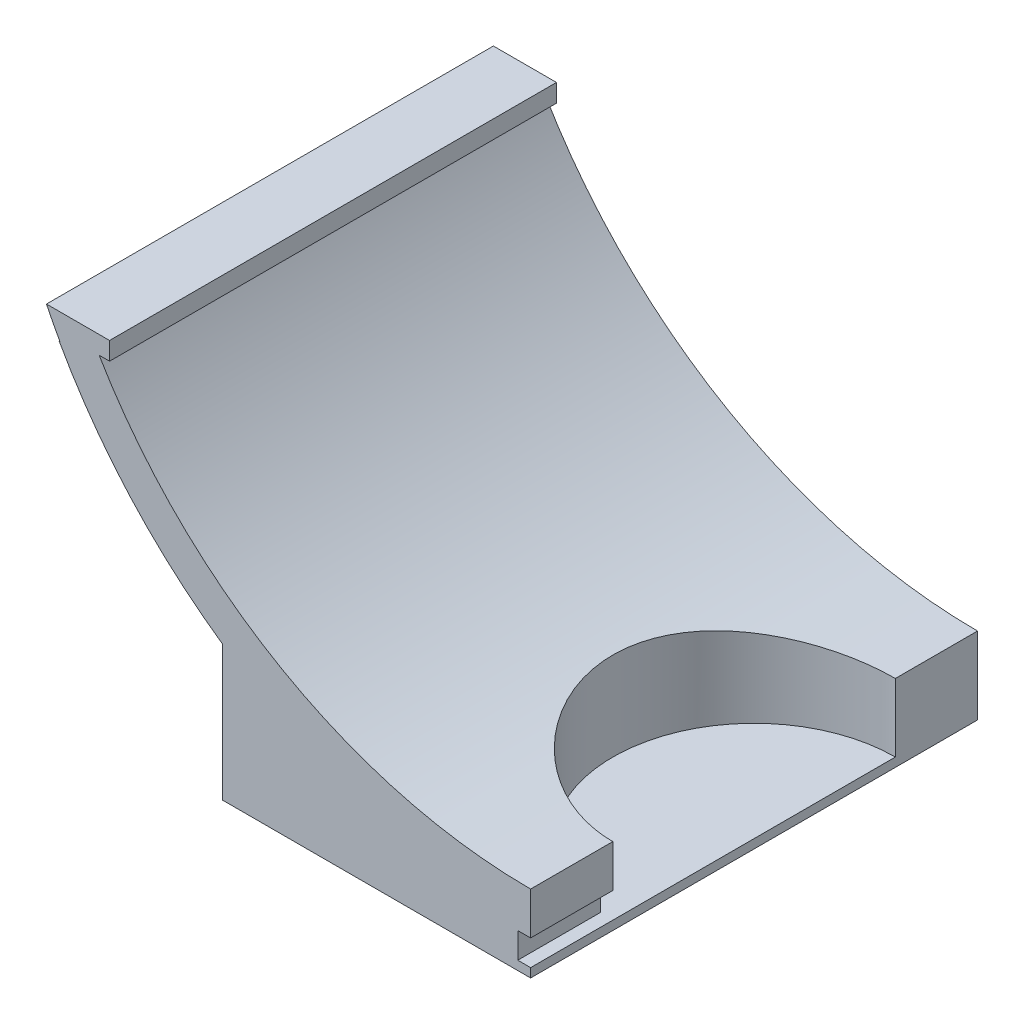
ISO-10303-21;
HEADER;
FILE_DESCRIPTION(('STEP AP214'),'2;1');
FILE_NAME('part.step','',(''),(''),'','','');
FILE_SCHEMA(('AUTOMOTIVE_DESIGN { 1 0 10303 214 1 1 1 1 }'));
ENDSEC;
DATA;
#1=APPLICATION_CONTEXT('core data for automotive mechanical design processes');
#2=APPLICATION_PROTOCOL_DEFINITION('international standard','automotive_design',2000,#1);
#3=PRODUCT_CONTEXT('',#1,'mechanical');
#4=PRODUCT('Part','Part','',(#3));
#5=PRODUCT_RELATED_PRODUCT_CATEGORY('part','',(#4));
#6=PRODUCT_DEFINITION_FORMATION('','',#4);
#7=PRODUCT_DEFINITION_CONTEXT('part definition',#1,'design');
#8=PRODUCT_DEFINITION('design','',#6,#7);
#9=PRODUCT_DEFINITION_SHAPE('','',#8);
#10=(LENGTH_UNIT() NAMED_UNIT(*) SI_UNIT(.MILLI.,.METRE.));
#11=(NAMED_UNIT(*) PLANE_ANGLE_UNIT() SI_UNIT($,.RADIAN.));
#12=(NAMED_UNIT(*) SI_UNIT($,.STERADIAN.) SOLID_ANGLE_UNIT());
#13=UNCERTAINTY_MEASURE_WITH_UNIT(LENGTH_MEASURE(1.E-05),#10,'distance_accuracy_value','');
#14=(GEOMETRIC_REPRESENTATION_CONTEXT(3) GLOBAL_UNCERTAINTY_ASSIGNED_CONTEXT((#13)) GLOBAL_UNIT_ASSIGNED_CONTEXT((#10,
#11,#12)) REPRESENTATION_CONTEXT('',''));
#15=CARTESIAN_POINT('',(0.,0.,0.));
#16=DIRECTION('',(0.,0.,1.));
#17=DIRECTION('',(1.,0.,0.));
#18=AXIS2_PLACEMENT_3D('',#15,#16,#17);
#19=CARTESIAN_POINT('',(0.,0.,174.));
#20=DIRECTION('',(0.,0.,1.));
#21=DIRECTION('',(1.,0.,0.));
#22=AXIS2_PLACEMENT_3D('',#19,#20,#21);
#23=PLANE('',#22);
#24=DIRECTION('',(0.,-1.,0.));
#25=VECTOR('',#24,1.);
#26=CARTESIAN_POINT('',(0.,0.,174.));
#27=LINE('',#26,#25);
#28=CARTESIAN_POINT('',(0.,-195.,174.));
#29=VERTEX_POINT('',#28);
#30=CARTESIAN_POINT('',(0.,-211.5,174.));
#31=VERTEX_POINT('',#30);
#32=EDGE_CURVE('E65',#29,#31,#27,.T.);
#33=ORIENTED_EDGE('',*,*,#32,.F.);
#34=CARTESIAN_POINT('',(0.,0.,174.));
#35=DIRECTION('',(0.,0.,-1.));
#36=DIRECTION('',(1.,0.,0.));
#37=AXIS2_PLACEMENT_3D('',#34,#35,#36);
#38=CIRCLE('',#37,195.);
#39=CARTESIAN_POINT('',(-168.,-99.,174.));
#40=VERTEX_POINT('',#39);
#41=EDGE_CURVE('E242',#29,#40,#38,.T.);
#42=ORIENTED_EDGE('',*,*,#41,.T.);
#43=DIRECTION('',(-1.,0.,0.));
#44=VECTOR('',#43,1.);
#45=CARTESIAN_POINT('',(-163.933126534708,-99.,174.));
#46=LINE('',#45,#44);
#47=CARTESIAN_POINT('',(-163.933126534708,-99.,174.));
#48=VERTEX_POINT('',#47);
#49=EDGE_CURVE('E288',#48,#40,#46,.T.);
#50=ORIENTED_EDGE('',*,*,#49,.F.);
#51=DIRECTION('',(0.,-1.,0.));
#52=VECTOR('',#51,1.);
#53=CARTESIAN_POINT('',(-163.933126534708,-92.,174.));
#54=LINE('',#53,#52);
#55=CARTESIAN_POINT('',(-163.933126534708,-92.,174.));
#56=VERTEX_POINT('',#55);
#57=EDGE_CURVE('E285',#56,#48,#54,.T.);
#58=ORIENTED_EDGE('',*,*,#57,.F.);
#59=DIRECTION('',(-1.,0.,0.));
#60=VECTOR('',#59,1.);
#61=CARTESIAN_POINT('',(-188.496850106308,-92.,174.));
#62=LINE('',#61,#60);
#63=CARTESIAN_POINT('',(-188.496850106308,-92.,174.));
#64=VERTEX_POINT('',#63);
#65=EDGE_CURVE('E273',#56,#64,#62,.T.);
#66=ORIENTED_EDGE('',*,*,#65,.T.);
#67=CARTESIAN_POINT('',(0.,0.,174.));
#68=DIRECTION('',(0.,0.,1.));
#69=DIRECTION('',(1.,0.,0.));
#70=AXIS2_PLACEMENT_3D('',#67,#68,#69);
#71=CIRCLE('',#70,209.75);
#72=CARTESIAN_POINT('',(-183.278647146906,-102.,174.));
#73=VERTEX_POINT('',#72);
#74=EDGE_CURVE('E269',#64,#73,#71,.T.);
#75=ORIENTED_EDGE('',*,*,#74,.T.);
#76=DIRECTION('',(1.,0.,0.));
#77=VECTOR('',#76,1.);
#78=CARTESIAN_POINT('',(0.,-102.,174.));
#79=LINE('',#78,#77);
#80=CARTESIAN_POINT('',(-183.56470248934,-102.,174.));
#81=VERTEX_POINT('',#80);
#82=EDGE_CURVE('E258',#81,#73,#79,.T.);
#83=ORIENTED_EDGE('',*,*,#82,.F.);
#84=CARTESIAN_POINT('',(0.,0.,174.));
#85=DIRECTION('',(0.,0.,1.));
#86=DIRECTION('',(1.,0.,0.));
#87=AXIS2_PLACEMENT_3D('',#84,#85,#86);
#88=CIRCLE('',#87,210.);
#89=CARTESIAN_POINT('',(-120.,-172.336879396141,174.));
#90=VERTEX_POINT('',#89);
#91=EDGE_CURVE('E165',#81,#90,#88,.T.);
#92=ORIENTED_EDGE('',*,*,#91,.T.);
#93=DIRECTION('',(0.,1.,0.));
#94=VECTOR('',#93,1.);
#95=CARTESIAN_POINT('',(-120.,0.,174.));
#96=LINE('',#95,#94);
#97=CARTESIAN_POINT('',(-120.,-225.,174.));
#98=VERTEX_POINT('',#97);
#99=EDGE_CURVE('E241',#98,#90,#96,.T.);
#100=ORIENTED_EDGE('',*,*,#99,.F.);
#101=DIRECTION('',(1.,0.,0.));
#102=VECTOR('',#101,1.);
#103=CARTESIAN_POINT('',(0.,-225.,174.));
#104=LINE('',#103,#102);
#105=CARTESIAN_POINT('',(0.,-225.,174.));
#106=VERTEX_POINT('',#105);
#107=EDGE_CURVE('E175',#98,#106,#104,.T.);
#108=ORIENTED_EDGE('',*,*,#107,.T.);
#109=CARTESIAN_POINT('',(0.,-221.5,174.));
#110=VERTEX_POINT('',#109);
#111=EDGE_CURVE('E322',#110,#106,#27,.T.);
#112=ORIENTED_EDGE('',*,*,#111,.F.);
#113=DIRECTION('',(-1.,0.,0.));
#114=VECTOR('',#113,1.);
#115=CARTESIAN_POINT('',(0.,-221.5,174.));
#116=LINE('',#115,#114);
#117=CARTESIAN_POINT('',(-5.,-221.5,174.));
#118=VERTEX_POINT('',#117);
#119=EDGE_CURVE('E316',#110,#118,#116,.T.);
#120=ORIENTED_EDGE('',*,*,#119,.T.);
#121=DIRECTION('',(0.,1.,0.));
#122=VECTOR('',#121,1.);
#123=CARTESIAN_POINT('',(-5.,0.,174.));
#124=LINE('',#123,#122);
#125=CARTESIAN_POINT('',(-5.,-211.5,174.));
#126=VERTEX_POINT('',#125);
#127=EDGE_CURVE('E309',#118,#126,#124,.T.);
#128=ORIENTED_EDGE('',*,*,#127,.T.);
#129=DIRECTION('',(1.,0.,0.));
#130=VECTOR('',#129,1.);
#131=CARTESIAN_POINT('',(0.,-211.5,174.));
#132=LINE('',#131,#130);
#133=EDGE_CURVE('E314',#126,#31,#132,.T.);
#134=ORIENTED_EDGE('',*,*,#133,.T.);
#135=EDGE_LOOP('',(#33,#42,#50,#58,#66,#75,#83,#92,#100,#108,#112,#120,#128,#134));
#136=FACE_BOUND('',#135,.T.);
#137=ADVANCED_FACE('F43',(#136),#23,.T.);
#138=CARTESIAN_POINT('',(0.,-221.5,87.));
#139=DIRECTION('',(0.,1.,0.));
#140=DIRECTION('',(0.,0.,1.));
#141=AXIS2_PLACEMENT_3D('',#138,#139,#140);
#142=CYLINDRICAL_SURFACE('',#141,55.);
#143=CARTESIAN_POINT('',(0.,-195.,142.));
#144=CARTESIAN_POINT('',(1.51277598464168,-194.999997304751,141.999995610297));
#145=CARTESIAN_POINT('',(3.02563306617673,-194.982353560653,141.93753465475));
#146=CARTESIAN_POINT('',(6.04030681610823,-194.912258782389,141.688232088754));
#147=CARTESIAN_POINT('',(7.54212268342941,-194.859805247374,141.501381541749));
#148=CARTESIAN_POINT('',(10.5242864998696,-194.721514711655,141.004861870919));
#149=CARTESIAN_POINT('',(12.0046267379808,-194.635666013523,140.69514971122));
#150=CARTESIAN_POINT('',(14.9327576670529,-194.432936319551,139.955576125098));
#151=CARTESIAN_POINT('',(16.3805488217454,-194.316055766129,139.525716411608));
#152=CARTESIAN_POINT('',(19.2316449690921,-194.054606947669,138.550081244053));
#153=CARTESIAN_POINT('',(20.6350093429244,-193.910077631711,138.004468735609));
#154=CARTESIAN_POINT('',(23.3900720949104,-193.597073533787,136.80124640194));
#155=CARTESIAN_POINT('',(24.7417703476622,-193.428598693706,136.143636304901));
#156=CARTESIAN_POINT('',(27.3849321959632,-193.072121722803,134.72125352611));
#157=CARTESIAN_POINT('',(28.6763923140339,-192.884118466645,133.956474667808));
#158=CARTESIAN_POINT('',(31.1910004963923,-192.493482436804,132.32513389038));
#159=CARTESIAN_POINT('',(32.4141473302252,-192.290849399763,131.458570138783));
#160=CARTESIAN_POINT('',(34.8121052649309,-191.871397239887,129.608255675445));
#161=CARTESIAN_POINT('',(35.985145512741,-191.654358471269,128.62225916456));
#162=CARTESIAN_POINT('',(38.2445264347831,-191.21631917666,126.556283582681));
#163=CARTESIAN_POINT('',(39.3308658605527,-190.995318593676,125.47630315882));
#164=CARTESIAN_POINT('',(41.4100573863605,-190.555337694959,123.229140506784));
#165=CARTESIAN_POINT('',(42.4028965244983,-190.336357663118,122.061946228299));
#166=CARTESIAN_POINT('',(44.2884084378103,-189.906482695444,119.647858408345));
#167=CARTESIAN_POINT('',(45.181080405655,-189.695587824785,118.400964224635));
#168=CARTESIAN_POINT('',(46.8765745407372,-189.283815921787,115.810239545886));
#169=CARTESIAN_POINT('',(47.6772977159791,-189.083215525293,114.464990030597));
#170=CARTESIAN_POINT('',(49.162230637943,-188.702577945346,111.708813244506));
#171=CARTESIAN_POINT('',(49.8464384655657,-188.522541100608,110.297884892409));
#172=CARTESIAN_POINT('',(51.0927350973465,-188.188599218257,107.42034060372));
#173=CARTESIAN_POINT('',(51.6548437850889,-188.034689926722,105.953733780017));
#174=CARTESIAN_POINT('',(52.6522576710364,-187.757844041035,102.97517381577));
#175=CARTESIAN_POINT('',(53.0875668143327,-187.634906483282,101.46322208765));
#176=CARTESIAN_POINT('',(53.8181863976163,-187.426635157743,98.4435623179981));
#177=CARTESIAN_POINT('',(54.1167289707947,-187.340437004747,96.936695711525));
#178=CARTESIAN_POINT('',(54.586856670881,-187.203993562236,93.9016672922743));
#179=CARTESIAN_POINT('',(54.75844373239,-187.153747724864,92.3735058043586));
#180=CARTESIAN_POINT('',(54.9730432374301,-187.090825739297,89.3076899008145));
#181=CARTESIAN_POINT('',(55.0160792915418,-187.078142692059,87.7700372803878));
#182=CARTESIAN_POINT('',(54.9732343190708,-187.09073748328,84.6967010099465));
#183=CARTESIAN_POINT('',(54.887355681379,-187.116014618306,83.1610173239737));
#184=CARTESIAN_POINT('',(54.5922403009783,-187.202323309921,80.1515882440086));
#185=CARTESIAN_POINT('',(54.3869816817835,-187.262201453032,78.6774175080696));
#186=CARTESIAN_POINT('',(53.8581194766046,-187.41499037387,75.7522458772274));
#187=CARTESIAN_POINT('',(53.5345187495676,-187.507900353601,74.3012444234769));
#188=CARTESIAN_POINT('',(52.7716565927596,-187.724024039912,71.4322191048295));
#189=CARTESIAN_POINT('',(52.3323881639886,-187.847239580238,70.0141972411653));
#190=CARTESIAN_POINT('',(51.3416985166608,-188.120423591712,67.2205508089576));
#191=CARTESIAN_POINT('',(50.7902750928457,-188.270392588895,65.8449270746838));
#192=CARTESIAN_POINT('',(49.5719407427942,-188.594869390542,63.1281257936024));
#193=CARTESIAN_POINT('',(48.9036859021021,-188.769657733188,61.7875846456117));
#194=CARTESIAN_POINT('',(47.4613520849324,-189.137446531583,59.1673453312611));
#195=CARTESIAN_POINT('',(46.6872726568405,-189.330447065053,57.8876474245857));
#196=CARTESIAN_POINT('',(45.0384344896766,-189.729435603099,55.3966655699284));
#197=CARTESIAN_POINT('',(44.1636575337009,-189.935425954569,54.1853940600432));
#198=CARTESIAN_POINT('',(42.3192039321344,-190.354877199058,51.838767050779));
#199=CARTESIAN_POINT('',(41.3495249884407,-190.568338272905,50.7034133909127));
#200=CARTESIAN_POINT('',(39.2840355631165,-191.005023396751,48.475253402716));
#201=CARTESIAN_POINT('',(38.1849013302693,-191.228318156092,47.3855395329822));
#202=CARTESIAN_POINT('',(35.8982517288536,-191.67073699137,45.3021832093801));
#203=CARTESIAN_POINT('',(34.7107341671541,-191.889860963646,44.3085431408805));
#204=CARTESIAN_POINT('',(32.2549075063342,-192.317899025981,42.4240354736116));
#205=CARTESIAN_POINT('',(30.9865936554316,-192.526812514263,41.5331739281184));
#206=CARTESIAN_POINT('',(28.3774891485624,-192.928639740406,39.8606401400473));
#207=CARTESIAN_POINT('',(27.0366989896612,-193.121553587973,39.0789671487516));
#208=CARTESIAN_POINT('',(24.2841503406643,-193.486995820346,37.626785886393));
#209=CARTESIAN_POINT('',(22.872049070732,-193.659409035535,36.9568978383738));
#210=CARTESIAN_POINT('',(19.9933641479954,-193.977736178376,35.7388260939951));
#211=CARTESIAN_POINT('',(18.5267800671251,-194.123649897772,35.1906433540984));
#212=CARTESIAN_POINT('',(15.5499999242052,-194.384745205353,34.2207670888056));
#213=CARTESIAN_POINT('',(14.0398126256082,-194.499932921909,33.7990483377956));
#214=CARTESIAN_POINT('',(10.9868456927494,-194.696246881347,33.0857502506882));
#215=CARTESIAN_POINT('',(9.44406710114175,-194.777374212154,32.7941667579131));
#216=CARTESIAN_POINT('',(6.38759737955367,-194.901161078377,32.3510633816287));
#217=CARTESIAN_POINT('',(4.87455911709058,-194.94497035096,32.1953533234206));
#218=CARTESIAN_POINT('',(1.84018665814559,-194.997220478891,32.0097825472414));
#219=CARTESIAN_POINT('',(0.318852639704865,-195.005662090324,31.9799191389463));
#220=CARTESIAN_POINT('',(-2.72067114375175,-194.986942029158,32.0463054967055));
#221=CARTESIAN_POINT('',(-4.23886122557451,-194.959784138108,32.1425418678469));
#222=CARTESIAN_POINT('',(-7.26103653739713,-194.870630723845,32.4602353545998));
#223=CARTESIAN_POINT('',(-8.765021849285,-194.808635401589,32.6816917478914));
#224=CARTESIAN_POINT('',(-11.7185674550566,-194.653074412565,33.2423005147627));
#225=CARTESIAN_POINT('',(-13.1686167043497,-194.560151370275,33.5790608624129));
#226=CARTESIAN_POINT('',(-16.0346101227006,-194.344941863136,34.3682562724752));
#227=CARTESIAN_POINT('',(-17.4505548668401,-194.222655893797,34.8206893828778));
#228=CARTESIAN_POINT('',(-20.239101414165,-193.951905110252,35.837693591339));
#229=CARTESIAN_POINT('',(-21.6116996780089,-193.803438164791,36.4022738191746));
#230=CARTESIAN_POINT('',(-24.3046889918928,-193.484162013078,37.6393085686977));
#231=CARTESIAN_POINT('',(-25.6250788776387,-193.313352308927,38.3117654944437));
#232=CARTESIAN_POINT('',(-28.2329132181185,-192.949922490515,39.7751609714886));
#233=CARTESIAN_POINT('',(-29.519061548626,-192.756916069748,40.5683133943173));
#234=CARTESIAN_POINT('',(-32.0203400821098,-192.35722551291,42.2565691287422));
#235=CARTESIAN_POINT('',(-33.235469482682,-192.150541222357,43.1516735919021));
#236=CARTESIAN_POINT('',(-35.5874725145358,-191.728870384718,45.0380551409026));
#237=CARTESIAN_POINT('',(-36.7243310563164,-191.513882249171,46.0293506827473));
#238=CARTESIAN_POINT('',(-38.9125867826961,-191.081278017958,48.1016524547747));
#239=CARTESIAN_POINT('',(-39.9639823382036,-190.863661872288,49.1826603942576));
#240=CARTESIAN_POINT('',(-42.0068287968446,-190.424663688709,51.4634820536823));
#241=CARTESIAN_POINT('',(-42.9953032651288,-190.203382512631,52.6659833901291));
#242=CARTESIAN_POINT('',(-44.8675674807035,-189.770453355497,55.151572228421));
#243=CARTESIAN_POINT('',(-45.7513547796848,-189.558805599808,56.4346616138977));
#244=CARTESIAN_POINT('',(-47.4079032742508,-189.151311295467,59.0730086424281));
#245=CARTESIAN_POINT('',(-48.1806657935975,-188.95546455843,60.4282654247568));
#246=CARTESIAN_POINT('',(-49.609306663953,-188.585422348909,63.2018895610344));
#247=CARTESIAN_POINT('',(-50.2651868880261,-188.41122652948,64.6202559031836));
#248=CARTESIAN_POINT('',(-51.4515194101969,-188.090714591469,67.5024025647285));
#249=CARTESIAN_POINT('',(-51.9826387878447,-187.944251048306,68.9658917148034));
#250=CARTESIAN_POINT('',(-52.9195244587185,-187.682606546131,71.935223920435));
#251=CARTESIAN_POINT('',(-53.32529079328,-187.567425576802,73.4410669620252));
#252=CARTESIAN_POINT('',(-54.0077324467009,-187.372065704206,76.4835904167211));
#253=CARTESIAN_POINT('',(-54.2844395155644,-187.291878192473,78.0202631482542));
#254=CARTESIAN_POINT('',(-54.706299470099,-187.169092825265,81.113035288433));
#255=CARTESIAN_POINT('',(-54.8514566322037,-187.126493747863,82.6691340639081));
#256=CARTESIAN_POINT('',(-55.0059350885892,-187.081140474726,85.7311540434134));
#257=CARTESIAN_POINT('',(-55.0200592029773,-187.07697748964,87.2368141228749));
#258=CARTESIAN_POINT('',(-54.9248583842064,-187.104950316674,90.2438606326164));
#259=CARTESIAN_POINT('',(-54.8155366395511,-187.137085191252,91.7452471722744));
#260=CARTESIAN_POINT('',(-54.474438998226,-187.236660182412,94.7327825235859));
#261=CARTESIAN_POINT('',(-54.242667739981,-187.304098961669,96.2189319102538));
#262=CARTESIAN_POINT('',(-53.6587131692459,-187.472223660234,99.1654548680127));
#263=CARTESIAN_POINT('',(-53.306529257297,-187.572909745057,100.625828310743));
#264=CARTESIAN_POINT('',(-52.4887374259627,-187.803383553097,103.496617769752));
#265=CARTESIAN_POINT('',(-52.0242661681516,-187.932878661644,104.907381560932));
#266=CARTESIAN_POINT('',(-50.9838485852516,-188.217793669274,107.684434863653));
#267=CARTESIAN_POINT('',(-50.4079034401043,-188.373213293946,109.050724845765));
#268=CARTESIAN_POINT('',(-49.1487429468255,-188.705656652546,111.730405540767));
#269=CARTESIAN_POINT('',(-48.4655133229456,-188.882683260896,113.043789184439));
#270=CARTESIAN_POINT('',(-46.9966216973714,-189.253510163334,115.609488643802));
#271=CARTESIAN_POINT('',(-46.2109569467775,-189.447310907518,116.861802819423));
#272=CARTESIAN_POINT('',(-44.5151536149936,-189.853062976584,119.337676095336));
#273=CARTESIAN_POINT('',(-43.6017904708369,-190.065400173821,120.558964323428));
#274=CARTESIAN_POINT('',(-41.6774853507142,-190.496612007318,122.920853720066));
#275=CARTESIAN_POINT('',(-40.66654134687,-190.715486779373,124.061453210924));
#276=CARTESIAN_POINT('',(-38.5533331692757,-191.153877639405,126.255068471827));
#277=CARTESIAN_POINT('',(-37.4510474753336,-191.373393866689,127.308063484396));
#278=CARTESIAN_POINT('',(-35.1622995871373,-191.807114286307,129.319424849606));
#279=CARTESIAN_POINT('',(-33.975836966903,-192.021318451751,130.277790723315));
#280=CARTESIAN_POINT('',(-31.4957016907239,-192.443866652879,132.116095107206));
#281=CARTESIAN_POINT('',(-30.2000984393956,-192.651933098431,132.993495252527));
#282=CARTESIAN_POINT('',(-27.5368111149729,-193.05060678832,134.63582320654));
#283=CARTESIAN_POINT('',(-26.169123975991,-193.241213289103,135.400746226079));
#284=CARTESIAN_POINT('',(-23.3717389221184,-193.599455338112,136.811793217101));
#285=CARTESIAN_POINT('',(-21.9420720610811,-193.76710221867,137.457975850282));
#286=CARTESIAN_POINT('',(-19.0302533374737,-194.074706450383,138.626638816058));
#287=CARTESIAN_POINT('',(-17.5481076720372,-194.21466705819,139.149133699094));
#288=CARTESIAN_POINT('',(-14.7498370514193,-194.445706299648,140.002612249688));
#289=CARTESIAN_POINT('',(-13.4390480304431,-194.540866112287,140.350078116561));
#290=CARTESIAN_POINT('',(-10.793930863323,-194.705537511506,140.947464884264));
#291=CARTESIAN_POINT('',(-9.45960527280495,-194.775051864951,141.197396308171));
#292=CARTESIAN_POINT('',(-6.77514063970241,-194.88689524458,141.597975951774));
#293=CARTESIAN_POINT('',(-5.42500326360649,-194.929227109878,141.748634540207));
#294=CARTESIAN_POINT('',(-2.71659953508749,-194.985781967651,141.949653066806));
#295=CARTESIAN_POINT('',(-1.35833245921605,-195.000002420084,142.000003941546));
#296=CARTESIAN_POINT('',(0.,-195.,142.));
#297=B_SPLINE_CURVE_WITH_KNOTS('',3,(#143,#144,#145,#146,#147,#148,#149,#150,#151,#152,#153,
#154,#155,#156,#157,#158,#159,#160,#161,#162,#163,#164,#165,#166,#167,#168,#169,#170,#171,#172,
#173,#174,#175,#176,#177,#178,#179,#180,#181,#182,#183,#184,#185,#186,#187,#188,#189,#190,#191,
#192,#193,#194,#195,#196,#197,#198,#199,#200,#201,#202,#203,#204,#205,#206,#207,#208,#209,#210,
#211,#212,#213,#214,#215,#216,#217,#218,#219,#220,#221,#222,#223,#224,#225,#226,#227,#228,#229,
#230,#231,#232,#233,#234,#235,#236,#237,#238,#239,#240,#241,#242,#243,#244,#245,#246,#247,#248,
#249,#250,#251,#252,#253,#254,#255,#256,#257,#258,#259,#260,#261,#262,#263,#264,#265,#266,#267,
#268,#269,#270,#271,#272,#273,#274,#275,#276,#277,#278,#279,#280,#281,#282,#283,#284,#285,#286,
#287,#288,#289,#290,#291,#292,#293,#294,#295,#296),.UNSPECIFIED.,.T.,.F.,(4,2,2,2,2,2,2,2,2,2,2,
2,2,2,2,2,2,2,2,2,2,2,2,2,2,2,2,2,2,2,2,2,2,2,2,2,2,2,2,2,2,2,2,2,2,2,2,2,2,2,2,2,2,2,2,2,2,2,2,
2,2,2,2,2,2,2,2,2,2,2,2,2,2,2,2,2,4),(0.,4.53708199552157,9.07448998504358,13.6134887398362,
18.1524227858136,22.6850092589732,27.2176067327461,31.7504655451402,36.2834059768057,
40.9211271113907,45.5589150155437,50.197344910504,54.835812187691,59.5650078593128,
64.2942814169713,69.0227842441797,73.7511399386241,78.3611174003492,82.9710246118645,
87.5800850833786,92.1890601464245,96.6525972976513,101.116026624422,105.579726093363,
110.043513338709,114.562504972605,119.081515892236,123.601345621908,128.121284828783,
132.80716953111,137.493170547082,142.179447410498,146.865692138025,151.577130512371,
156.28860591185,160.99914089314,165.709525403472,170.268916812972,174.828210752236,
179.387020421064,183.945803793097,188.415231042029,192.88458287313,197.35429869862,
201.824114146662,206.388902897175,210.953743212778,215.51946111419,220.085266026704,
224.796514789388,229.507873711867,234.219176455568,238.930403692821,243.615836081421,
248.301266924986,252.985544492066,257.669669776858,262.18139537959,266.693004450877,
271.204442633299,275.715903275666,280.183478519555,284.651006477133,289.119129408338,
293.587372268618,298.20138291234,302.815489462845,307.430686209123,312.04590631243,
316.775727940309,321.505750900575,326.233430752597,330.960554170728,335.034930030026,
339.108866179737,343.182376752053,347.256255374672),.UNSPECIFIED.);
#298=CARTESIAN_POINT('',(0.,-195.,32.));
#299=VERTEX_POINT('',#298);
#300=CARTESIAN_POINT('',(0.,-195.,142.));
#301=VERTEX_POINT('',#300);
#302=EDGE_CURVE('E160',#299,#301,#297,.T.);
#303=ORIENTED_EDGE('',*,*,#302,.T.);
#304=DIRECTION('',(0.,1.,0.));
#305=VECTOR('',#304,1.);
#306=CARTESIAN_POINT('',(0.,-221.5,142.));
#307=LINE('',#306,#305);
#308=CARTESIAN_POINT('',(0.,-211.5,142.));
#309=VERTEX_POINT('',#308);
#310=EDGE_CURVE('E148',#301,#309,#307,.F.);
#311=ORIENTED_EDGE('',*,*,#310,.T.);
#312=CARTESIAN_POINT('',(0.,-211.5,87.));
#313=DIRECTION('',(0.,-1.,0.));
#314=DIRECTION('',(0.,0.,-1.));
#315=AXIS2_PLACEMENT_3D('',#312,#313,#314);
#316=CIRCLE('',#315,55.);
#317=CARTESIAN_POINT('',(-5.,-211.5,141.772255750517));
#318=VERTEX_POINT('',#317);
#319=EDGE_CURVE('E51',#318,#309,#316,.F.);
#320=ORIENTED_EDGE('',*,*,#319,.F.);
#321=DIRECTION('',(0.,1.,0.));
#322=VECTOR('',#321,1.);
#323=CARTESIAN_POINT('',(-5.,-221.5,141.772255750517));
#324=LINE('',#323,#322);
#325=CARTESIAN_POINT('',(-5.,-221.5,141.772255750517));
#326=VERTEX_POINT('',#325);
#327=EDGE_CURVE('E305',#326,#318,#324,.T.);
#328=ORIENTED_EDGE('',*,*,#327,.F.);
#329=CARTESIAN_POINT('',(0.,-221.5,87.));
#330=DIRECTION('',(0.,1.,0.));
#331=DIRECTION('',(0.,0.,1.));
#332=AXIS2_PLACEMENT_3D('',#329,#330,#331);
#333=CIRCLE('',#332,55.);
#334=CARTESIAN_POINT('',(0.,-221.5,32.));
#335=VERTEX_POINT('',#334);
#336=EDGE_CURVE('E176',#335,#326,#333,.T.);
#337=ORIENTED_EDGE('',*,*,#336,.F.);
#338=DIRECTION('',(0.,1.,0.));
#339=VECTOR('',#338,1.);
#340=CARTESIAN_POINT('',(0.,-221.5,32.));
#341=LINE('',#340,#339);
#342=EDGE_CURVE('E58',#335,#299,#341,.T.);
#343=ORIENTED_EDGE('',*,*,#342,.T.);
#344=EDGE_LOOP('',(#303,#311,#320,#328,#337,#343));
#345=FACE_BOUND('',#344,.T.);
#346=ADVANCED_FACE('F157',(#345),#142,.F.);
#347=CARTESIAN_POINT('',(0.,0.,174.));
#348=DIRECTION('',(0.,0.,-1.));
#349=DIRECTION('',(-1.,0.,0.));
#350=AXIS2_PLACEMENT_3D('',#347,#348,#349);
#351=CYLINDRICAL_SURFACE('',#350,210.);
#352=DIRECTION('',(0.,0.,1.));
#353=VECTOR('',#352,1.);
#354=CARTESIAN_POINT('',(-120.,-172.336879396141,-115.957504903706));
#355=LINE('',#354,#353);
#356=CARTESIAN_POINT('',(-120.,-172.336879396141,0.));
#357=VERTEX_POINT('',#356);
#358=EDGE_CURVE('E245',#357,#90,#355,.T.);
#359=ORIENTED_EDGE('',*,*,#358,.T.);
#360=ORIENTED_EDGE('',*,*,#91,.F.);
#361=DIRECTION('',(0.,0.,-1.));
#362=VECTOR('',#361,1.);
#363=CARTESIAN_POINT('',(-183.56470248934,-102.,174.));
#364=LINE('',#363,#362);
#365=CARTESIAN_POINT('',(-183.56470248934,-102.,0.));
#366=VERTEX_POINT('',#365);
#367=EDGE_CURVE('E253',#81,#366,#364,.T.);
#368=ORIENTED_EDGE('',*,*,#367,.T.);
#369=CARTESIAN_POINT('',(0.,0.,0.));
#370=DIRECTION('',(0.,0.,1.));
#371=DIRECTION('',(1.,0.,0.));
#372=AXIS2_PLACEMENT_3D('',#369,#370,#371);
#373=CIRCLE('',#372,210.);
#374=EDGE_CURVE('E167',#366,#357,#373,.T.);
#375=ORIENTED_EDGE('',*,*,#374,.T.);
#376=EDGE_LOOP('',(#359,#360,#368,#375));
#377=FACE_BOUND('',#376,.T.);
#378=ADVANCED_FACE('F45',(#377),#351,.T.);
#379=CARTESIAN_POINT('',(0.,0.,0.));
#380=DIRECTION('',(0.,0.,1.));
#381=DIRECTION('',(1.,0.,0.));
#382=AXIS2_PLACEMENT_3D('',#379,#380,#381);
#383=PLANE('',#382);
#384=CARTESIAN_POINT('',(0.,0.,0.));
#385=DIRECTION('',(0.,0.,1.));
#386=DIRECTION('',(1.,0.,0.));
#387=AXIS2_PLACEMENT_3D('',#384,#385,#386);
#388=CIRCLE('',#387,195.);
#389=CARTESIAN_POINT('',(-168.,-99.,0.));
#390=VERTEX_POINT('',#389);
#391=CARTESIAN_POINT('',(0.,-195.,0.));
#392=VERTEX_POINT('',#391);
#393=EDGE_CURVE('E231',#390,#392,#388,.T.);
#394=ORIENTED_EDGE('',*,*,#393,.T.);
#395=DIRECTION('',(0.,-1.,0.));
#396=VECTOR('',#395,1.);
#397=CARTESIAN_POINT('',(0.,0.,0.));
#398=LINE('',#397,#396);
#399=CARTESIAN_POINT('',(0.,-225.,0.));
#400=VERTEX_POINT('',#399);
#401=EDGE_CURVE('E233',#392,#400,#398,.T.);
#402=ORIENTED_EDGE('',*,*,#401,.T.);
#403=DIRECTION('',(1.,0.,0.));
#404=VECTOR('',#403,1.);
#405=CARTESIAN_POINT('',(0.,-225.,0.));
#406=LINE('',#405,#404);
#407=CARTESIAN_POINT('',(-120.,-225.,0.));
#408=VERTEX_POINT('',#407);
#409=EDGE_CURVE('E300',#408,#400,#406,.T.);
#410=ORIENTED_EDGE('',*,*,#409,.F.);
#411=DIRECTION('',(0.,-1.,0.));
#412=VECTOR('',#411,1.);
#413=CARTESIAN_POINT('',(-120.,0.,0.));
#414=LINE('',#413,#412);
#415=EDGE_CURVE('E252',#357,#408,#414,.T.);
#416=ORIENTED_EDGE('',*,*,#415,.F.);
#417=ORIENTED_EDGE('',*,*,#374,.F.);
#418=DIRECTION('',(-1.,0.,0.));
#419=VECTOR('',#418,1.);
#420=CARTESIAN_POINT('',(0.,-102.,0.));
#421=LINE('',#420,#419);
#422=CARTESIAN_POINT('',(-183.278647146906,-102.,0.));
#423=VERTEX_POINT('',#422);
#424=EDGE_CURVE('E259',#423,#366,#421,.T.);
#425=ORIENTED_EDGE('',*,*,#424,.F.);
#426=CARTESIAN_POINT('',(0.,0.,0.));
#427=DIRECTION('',(0.,0.,1.));
#428=DIRECTION('',(1.,0.,0.));
#429=AXIS2_PLACEMENT_3D('',#426,#427,#428);
#430=CIRCLE('',#429,209.75);
#431=CARTESIAN_POINT('',(-188.496850106308,-92.,0.));
#432=VERTEX_POINT('',#431);
#433=EDGE_CURVE('E271',#423,#432,#430,.F.);
#434=ORIENTED_EDGE('',*,*,#433,.T.);
#435=DIRECTION('',(1.,0.,0.));
#436=VECTOR('',#435,1.);
#437=CARTESIAN_POINT('',(-188.496850106308,-92.,0.));
#438=LINE('',#437,#436);
#439=CARTESIAN_POINT('',(-163.933126534708,-92.,0.));
#440=VERTEX_POINT('',#439);
#441=EDGE_CURVE('E276',#432,#440,#438,.T.);
#442=ORIENTED_EDGE('',*,*,#441,.T.);
#443=DIRECTION('',(0.,-1.,0.));
#444=VECTOR('',#443,1.);
#445=CARTESIAN_POINT('',(-163.933126534708,-92.,0.));
#446=LINE('',#445,#444);
#447=CARTESIAN_POINT('',(-163.933126534708,-99.,0.));
#448=VERTEX_POINT('',#447);
#449=EDGE_CURVE('E294',#440,#448,#446,.T.);
#450=ORIENTED_EDGE('',*,*,#449,.T.);
#451=DIRECTION('',(-1.,0.,0.));
#452=VECTOR('',#451,1.);
#453=CARTESIAN_POINT('',(-163.933126534708,-99.,0.));
#454=LINE('',#453,#452);
#455=EDGE_CURVE('E237',#448,#390,#454,.T.);
#456=ORIENTED_EDGE('',*,*,#455,.T.);
#457=EDGE_LOOP('',(#394,#402,#410,#416,#417,#425,#434,#442,#450,#456));
#458=FACE_BOUND('',#457,.T.);
#459=ADVANCED_FACE('F216',(#458),#383,.F.);
#460=CARTESIAN_POINT('',(0.,-102.,-5.64183047049638));
#461=DIRECTION('',(0.,-1.,0.));
#462=DIRECTION('',(0.,0.,-1.));
#463=AXIS2_PLACEMENT_3D('',#460,#461,#462);
#464=PLANE('',#463);
#465=ORIENTED_EDGE('',*,*,#82,.T.);
#466=DIRECTION('',(0.,0.,1.));
#467=VECTOR('',#466,1.);
#468=CARTESIAN_POINT('',(-183.278647146906,-102.,-394.954823365914));
#469=LINE('',#468,#467);
#470=EDGE_CURVE('E247',#73,#423,#469,.F.);
#471=ORIENTED_EDGE('',*,*,#470,.T.);
#472=ORIENTED_EDGE('',*,*,#424,.T.);
#473=ORIENTED_EDGE('',*,*,#367,.F.);
#474=EDGE_LOOP('',(#465,#471,#472,#473));
#475=FACE_BOUND('',#474,.T.);
#476=ADVANCED_FACE('F215',(#475),#464,.F.);
#477=CARTESIAN_POINT('',(-120.,0.,-115.957504903706));
#478=DIRECTION('',(1.,0.,0.));
#479=DIRECTION('',(0.,0.,-1.));
#480=AXIS2_PLACEMENT_3D('',#477,#478,#479);
#481=PLANE('',#480);
#482=ORIENTED_EDGE('',*,*,#358,.F.);
#483=ORIENTED_EDGE('',*,*,#415,.T.);
#484=DIRECTION('',(0.,0.,1.));
#485=VECTOR('',#484,1.);
#486=CARTESIAN_POINT('',(-120.,-225.,0.));
#487=LINE('',#486,#485);
#488=EDGE_CURVE('E296',#408,#98,#487,.T.);
#489=ORIENTED_EDGE('',*,*,#488,.T.);
#490=ORIENTED_EDGE('',*,*,#99,.T.);
#491=EDGE_LOOP('',(#482,#483,#489,#490));
#492=FACE_BOUND('',#491,.T.);
#493=ADVANCED_FACE('F223',(#492),#481,.F.);
#494=CARTESIAN_POINT('',(0.,0.,-365.268394471791));
#495=DIRECTION('',(0.,0.,1.));
#496=DIRECTION('',(1.,0.,0.));
#497=AXIS2_PLACEMENT_3D('',#494,#495,#496);
#498=CYLINDRICAL_SURFACE('',#497,195.);
#499=DIRECTION('',(0.,0.,1.));
#500=VECTOR('',#499,1.);
#501=CARTESIAN_POINT('',(0.,-195.,-365.268394471791));
#502=LINE('',#501,#500);
#503=EDGE_CURVE('E319',#392,#299,#502,.T.);
#504=ORIENTED_EDGE('',*,*,#503,.F.);
#505=ORIENTED_EDGE('',*,*,#393,.F.);
#506=DIRECTION('',(0.,0.,-1.));
#507=VECTOR('',#506,1.);
#508=CARTESIAN_POINT('',(-168.,-99.,183.45827557051));
#509=LINE('',#508,#507);
#510=EDGE_CURVE('E277',#40,#390,#509,.T.);
#511=ORIENTED_EDGE('',*,*,#510,.F.);
#512=ORIENTED_EDGE('',*,*,#41,.F.);
#513=EDGE_CURVE('E326',#301,#29,#502,.T.);
#514=ORIENTED_EDGE('',*,*,#513,.F.);
#515=ORIENTED_EDGE('',*,*,#302,.F.);
#516=EDGE_LOOP('',(#504,#505,#511,#512,#514,#515));
#517=FACE_BOUND('',#516,.T.);
#518=ADVANCED_FACE('F177',(#517),#498,.F.);
#519=CARTESIAN_POINT('',(0.,0.,-394.954823365914));
#520=DIRECTION('',(0.,0.,1.));
#521=DIRECTION('',(1.,0.,0.));
#522=AXIS2_PLACEMENT_3D('',#519,#520,#521);
#523=CYLINDRICAL_SURFACE('',#522,209.75);
#524=ORIENTED_EDGE('',*,*,#470,.F.);
#525=ORIENTED_EDGE('',*,*,#74,.F.);
#526=DIRECTION('',(0.,0.,1.));
#527=VECTOR('',#526,1.);
#528=CARTESIAN_POINT('',(-188.496850106308,-92.,-394.954823365914));
#529=LINE('',#528,#527);
#530=EDGE_CURVE('E274',#432,#64,#529,.T.);
#531=ORIENTED_EDGE('',*,*,#530,.F.);
#532=ORIENTED_EDGE('',*,*,#433,.F.);
#533=EDGE_LOOP('',(#524,#525,#531,#532));
#534=FACE_BOUND('',#533,.T.);
#535=ADVANCED_FACE('F200',(#534),#523,.T.);
#536=CARTESIAN_POINT('',(-188.496850106308,-92.,-394.954823365914));
#537=DIRECTION('',(0.,1.,0.));
#538=DIRECTION('',(0.,0.,1.));
#539=AXIS2_PLACEMENT_3D('',#536,#537,#538);
#540=PLANE('',#539);
#541=ORIENTED_EDGE('',*,*,#441,.F.);
#542=ORIENTED_EDGE('',*,*,#530,.T.);
#543=ORIENTED_EDGE('',*,*,#65,.F.);
#544=DIRECTION('',(0.,0.,-1.));
#545=VECTOR('',#544,1.);
#546=CARTESIAN_POINT('',(-163.933126534708,-92.,183.45827557051));
#547=LINE('',#546,#545);
#548=EDGE_CURVE('E282',#56,#440,#547,.T.);
#549=ORIENTED_EDGE('',*,*,#548,.T.);
#550=EDGE_LOOP('',(#541,#542,#543,#549));
#551=FACE_BOUND('',#550,.T.);
#552=ADVANCED_FACE('F198',(#551),#540,.T.);
#553=CARTESIAN_POINT('',(-163.933126534708,-92.,183.45827557051));
#554=DIRECTION('',(1.,0.,0.));
#555=DIRECTION('',(0.,0.,-1.));
#556=AXIS2_PLACEMENT_3D('',#553,#554,#555);
#557=PLANE('',#556);
#558=ORIENTED_EDGE('',*,*,#548,.F.);
#559=ORIENTED_EDGE('',*,*,#57,.T.);
#560=DIRECTION('',(0.,0.,-1.));
#561=VECTOR('',#560,1.);
#562=CARTESIAN_POINT('',(-163.933126534708,-99.,183.45827557051));
#563=LINE('',#562,#561);
#564=EDGE_CURVE('E286',#48,#448,#563,.T.);
#565=ORIENTED_EDGE('',*,*,#564,.T.);
#566=ORIENTED_EDGE('',*,*,#449,.F.);
#567=EDGE_LOOP('',(#558,#559,#565,#566));
#568=FACE_BOUND('',#567,.T.);
#569=ADVANCED_FACE('F194',(#568),#557,.T.);
#570=CARTESIAN_POINT('',(-163.933126534708,-99.,183.45827557051));
#571=DIRECTION('',(0.,-1.,0.));
#572=DIRECTION('',(1.,0.,0.));
#573=AXIS2_PLACEMENT_3D('',#570,#571,#572);
#574=PLANE('',#573);
#575=ORIENTED_EDGE('',*,*,#564,.F.);
#576=ORIENTED_EDGE('',*,*,#49,.T.);
#577=ORIENTED_EDGE('',*,*,#510,.T.);
#578=ORIENTED_EDGE('',*,*,#455,.F.);
#579=EDGE_LOOP('',(#575,#576,#577,#578));
#580=FACE_BOUND('',#579,.T.);
#581=ADVANCED_FACE('F190',(#580),#574,.T.);
#582=CARTESIAN_POINT('',(0.,-225.,0.));
#583=DIRECTION('',(0.,-1.,0.));
#584=DIRECTION('',(0.,0.,-1.));
#585=AXIS2_PLACEMENT_3D('',#582,#583,#584);
#586=PLANE('',#585);
#587=DIRECTION('',(0.,0.,-1.));
#588=VECTOR('',#587,1.);
#589=CARTESIAN_POINT('',(0.,-225.,0.));
#590=LINE('',#589,#588);
#591=EDGE_CURVE('E320',#106,#400,#590,.T.);
#592=ORIENTED_EDGE('',*,*,#591,.F.);
#593=ORIENTED_EDGE('',*,*,#107,.F.);
#594=ORIENTED_EDGE('',*,*,#488,.F.);
#595=ORIENTED_EDGE('',*,*,#409,.T.);
#596=EDGE_LOOP('',(#592,#593,#594,#595));
#597=FACE_BOUND('',#596,.T.);
#598=ADVANCED_FACE('F187',(#597),#586,.T.);
#599=CARTESIAN_POINT('',(0.,-221.5,0.));
#600=DIRECTION('',(0.,1.,0.));
#601=DIRECTION('',(0.,0.,1.));
#602=AXIS2_PLACEMENT_3D('',#599,#600,#601);
#603=PLANE('',#602);
#604=DIRECTION('',(0.,0.,1.));
#605=VECTOR('',#604,1.);
#606=CARTESIAN_POINT('',(0.,-221.5,0.));
#607=LINE('',#606,#605);
#608=EDGE_CURVE('E324',#335,#110,#607,.T.);
#609=ORIENTED_EDGE('',*,*,#608,.F.);
#610=ORIENTED_EDGE('',*,*,#336,.T.);
#611=DIRECTION('',(0.,0.,1.));
#612=VECTOR('',#611,1.);
#613=CARTESIAN_POINT('',(-5.,-221.5,87.));
#614=LINE('',#613,#612);
#615=EDGE_CURVE('E307',#326,#118,#614,.T.);
#616=ORIENTED_EDGE('',*,*,#615,.T.);
#617=ORIENTED_EDGE('',*,*,#119,.F.);
#618=EDGE_LOOP('',(#609,#610,#616,#617));
#619=FACE_BOUND('',#618,.T.);
#620=ADVANCED_FACE('F185',(#619),#603,.T.);
#621=CARTESIAN_POINT('',(0.,-211.5,87.));
#622=DIRECTION('',(0.,-1.,0.));
#623=DIRECTION('',(0.,0.,-1.));
#624=AXIS2_PLACEMENT_3D('',#621,#622,#623);
#625=PLANE('',#624);
#626=DIRECTION('',(0.,0.,-1.));
#627=VECTOR('',#626,1.);
#628=CARTESIAN_POINT('',(0.,-211.5,87.));
#629=LINE('',#628,#627);
#630=EDGE_CURVE('E12',#31,#309,#629,.T.);
#631=ORIENTED_EDGE('',*,*,#630,.F.);
#632=ORIENTED_EDGE('',*,*,#133,.F.);
#633=DIRECTION('',(0.,0.,1.));
#634=VECTOR('',#633,1.);
#635=CARTESIAN_POINT('',(-5.,-211.5,87.));
#636=LINE('',#635,#634);
#637=EDGE_CURVE('E164',#318,#126,#636,.T.);
#638=ORIENTED_EDGE('',*,*,#637,.F.);
#639=ORIENTED_EDGE('',*,*,#319,.T.);
#640=EDGE_LOOP('',(#631,#632,#638,#639));
#641=FACE_BOUND('',#640,.T.);
#642=ADVANCED_FACE('F163',(#641),#625,.T.);
#643=CARTESIAN_POINT('',(-5.,0.,87.));
#644=DIRECTION('',(1.,0.,0.));
#645=DIRECTION('',(0.,0.,-1.));
#646=AXIS2_PLACEMENT_3D('',#643,#644,#645);
#647=PLANE('',#646);
#648=ORIENTED_EDGE('',*,*,#327,.T.);
#649=ORIENTED_EDGE('',*,*,#637,.T.);
#650=ORIENTED_EDGE('',*,*,#127,.F.);
#651=ORIENTED_EDGE('',*,*,#615,.F.);
#652=EDGE_LOOP('',(#648,#649,#650,#651));
#653=FACE_BOUND('',#652,.T.);
#654=ADVANCED_FACE('F345',(#653),#647,.T.);
#655=CARTESIAN_POINT('',(0.,0.,0.));
#656=DIRECTION('',(-1.,0.,0.));
#657=DIRECTION('',(0.,0.,1.));
#658=AXIS2_PLACEMENT_3D('',#655,#656,#657);
#659=PLANE('',#658);
#660=ORIENTED_EDGE('',*,*,#513,.T.);
#661=ORIENTED_EDGE('',*,*,#32,.T.);
#662=ORIENTED_EDGE('',*,*,#630,.T.);
#663=ORIENTED_EDGE('',*,*,#310,.F.);
#664=EDGE_LOOP('',(#660,#661,#662,#663));
#665=FACE_BOUND('',#664,.T.);
#666=ADVANCED_FACE('F147',(#665),#659,.F.);
#667=ORIENTED_EDGE('',*,*,#503,.T.);
#668=ORIENTED_EDGE('',*,*,#342,.F.);
#669=ORIENTED_EDGE('',*,*,#608,.T.);
#670=ORIENTED_EDGE('',*,*,#111,.T.);
#671=ORIENTED_EDGE('',*,*,#591,.T.);
#672=ORIENTED_EDGE('',*,*,#401,.F.);
#673=EDGE_LOOP('',(#667,#668,#669,#670,#671,#672));
#674=FACE_BOUND('',#673,.T.);
#675=ADVANCED_FACE('F330',(#674),#659,.F.);
#676=CLOSED_SHELL('',(#137,#346,#378,#459,#476,#493,#518,#535,#552,#569,#581,#598,#620,#642,
#654,#666,#675));
#677=MANIFOLD_SOLID_BREP('B2',#676);
#678=ADVANCED_BREP_SHAPE_REPRESENTATION('',(#18,#677),#14);
#679=SHAPE_DEFINITION_REPRESENTATION(#9,#678);
ENDSEC;
END-ISO-10303-21;
